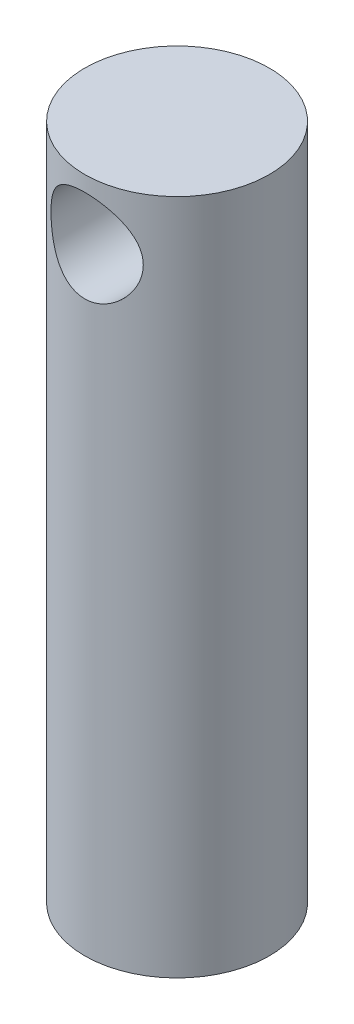
ISO-10303-21;
HEADER;
FILE_DESCRIPTION(('STEP AP214'),'2;1');
FILE_NAME('part.step','',(''),(''),'','','');
FILE_SCHEMA(('AUTOMOTIVE_DESIGN { 1 0 10303 214 1 1 1 1 }'));
ENDSEC;
DATA;
#1=APPLICATION_CONTEXT('core data for automotive mechanical design processes');
#2=APPLICATION_PROTOCOL_DEFINITION('international standard','automotive_design',2000,#1);
#3=PRODUCT_CONTEXT('',#1,'mechanical');
#4=PRODUCT('Part','Part','',(#3));
#5=PRODUCT_RELATED_PRODUCT_CATEGORY('part','',(#4));
#6=PRODUCT_DEFINITION_FORMATION('','',#4);
#7=PRODUCT_DEFINITION_CONTEXT('part definition',#1,'design');
#8=PRODUCT_DEFINITION('design','',#6,#7);
#9=PRODUCT_DEFINITION_SHAPE('','',#8);
#10=(LENGTH_UNIT() NAMED_UNIT(*) SI_UNIT(.MILLI.,.METRE.));
#11=(NAMED_UNIT(*) PLANE_ANGLE_UNIT() SI_UNIT($,.RADIAN.));
#12=(NAMED_UNIT(*) SI_UNIT($,.STERADIAN.) SOLID_ANGLE_UNIT());
#13=UNCERTAINTY_MEASURE_WITH_UNIT(LENGTH_MEASURE(1.E-05),#10,'distance_accuracy_value','');
#14=(GEOMETRIC_REPRESENTATION_CONTEXT(3) GLOBAL_UNCERTAINTY_ASSIGNED_CONTEXT((#13)) GLOBAL_UNIT_ASSIGNED_CONTEXT((#10,
#11,#12)) REPRESENTATION_CONTEXT('',''));
#15=CARTESIAN_POINT('',(0.,0.,0.));
#16=DIRECTION('',(0.,0.,1.));
#17=DIRECTION('',(1.,0.,0.));
#18=AXIS2_PLACEMENT_3D('',#15,#16,#17);
#19=CARTESIAN_POINT('',(0.,110.,0.));
#20=DIRECTION('',(0.,-1.,0.));
#21=DIRECTION('',(0.,0.,-1.));
#22=AXIS2_PLACEMENT_3D('',#19,#20,#21);
#23=CYLINDRICAL_SURFACE('',#22,15.);
#24=CARTESIAN_POINT('',(0.,107.5,-15.));
#25=CARTESIAN_POINT('',(-0.197233319634611,107.499999341654,-14.999999396748));
#26=CARTESIAN_POINT('',(-0.394480447697188,107.492210837757,-14.9961007967494));
#27=CARTESIAN_POINT('',(-0.787521887153942,107.461145658147,-14.9806046675974));
#28=CARTESIAN_POINT('',(-0.983315529042056,107.437862244582,-14.9690037891684));
#29=CARTESIAN_POINT('',(-1.37217475867236,107.376038848569,-14.9383810125726));
#30=CARTESIAN_POINT('',(-1.56523604806031,107.337477111355,-14.9193485331296));
#31=CARTESIAN_POINT('',(-1.94703954292032,107.245523957887,-14.8743407347001));
#32=CARTESIAN_POINT('',(-2.13577994705356,107.192126474356,-14.8483625753491));
#33=CARTESIAN_POINT('',(-2.50682232648196,107.071331904137,-14.7902312659494));
#34=CARTESIAN_POINT('',(-2.68914865467159,107.003996476536,-14.7581053582234));
#35=CARTESIAN_POINT('',(-3.04717071465554,106.855824594522,-14.6883654003789));
#36=CARTESIAN_POINT('',(-3.22286404618521,106.774983309117,-14.6507493870819));
#37=CARTESIAN_POINT('',(-3.73833299838093,106.513305804432,-14.5309652318162));
#38=CARTESIAN_POINT('',(-4.06690309396203,106.313182489991,-14.4417945935421));
#39=CARTESIAN_POINT('',(-4.70640207469269,105.853561695031,-14.2466964933283));
#40=CARTESIAN_POINT('',(-5.01506114711124,105.591204657963,-14.1400816438171));
#41=CARTESIAN_POINT('',(-5.44308231880779,105.163685002352,-13.9784212341451));
#42=CARTESIAN_POINT('',(-5.58001386248578,105.015395728627,-13.9242051894336));
#43=CARTESIAN_POINT('',(-5.84165491097173,104.708054400909,-13.8164776143495));
#44=CARTESIAN_POINT('',(-5.96636238182053,104.549000563222,-13.7629662024985));
#45=CARTESIAN_POINT('',(-6.21203614609388,104.208102763748,-13.6539394008806));
#46=CARTESIAN_POINT('',(-6.33195448776317,104.025448632702,-13.5985925588041));
#47=CARTESIAN_POINT('',(-6.5558172168629,103.649532833344,-13.492094780061));
#48=CARTESIAN_POINT('',(-6.65976829479199,103.456275654176,-13.4409420901999));
#49=CARTESIAN_POINT('',(-6.85079105860991,103.060225398471,-13.3445910586524));
#50=CARTESIAN_POINT('',(-6.93786789550111,102.857435255512,-13.2993909012604));
#51=CARTESIAN_POINT('',(-7.09420885808462,102.443585588166,-13.2166574842323));
#52=CARTESIAN_POINT('',(-7.16347495754887,102.232526983073,-13.1791233751457));
#53=CARTESIAN_POINT('',(-7.27969095551671,101.81656370687,-13.1152671777941));
#54=CARTESIAN_POINT('',(-7.32772731202128,101.61204530522,-13.088409003038));
#55=CARTESIAN_POINT('',(-7.40657415403486,101.198712654553,-13.0439533148363));
#56=CARTESIAN_POINT('',(-7.43738537640827,100.989898589695,-13.0263554052528));
#57=CARTESIAN_POINT('',(-7.48128583073154,100.569989048897,-13.0011924893624));
#58=CARTESIAN_POINT('',(-7.49439005257304,100.358895655336,-12.993618996979));
#59=CARTESIAN_POINT('',(-7.50270600478308,99.9362481207691,-12.9888194928446));
#60=CARTESIAN_POINT('',(-7.49791944225105,99.7246940256466,-12.9915924938538));
#61=CARTESIAN_POINT('',(-7.47218723712111,99.3284463588686,-13.0064057924061));
#62=CARTESIAN_POINT('',(-7.4532487913187,99.143574771867,-13.0172945533465));
#63=CARTESIAN_POINT('',(-7.40181622089092,98.7762705501265,-13.0466085215773));
#64=CARTESIAN_POINT('',(-7.3693176158615,98.5938387420939,-13.065036219764));
#65=CARTESIAN_POINT('',(-7.29114561844776,98.2327060817986,-13.1088213055836));
#66=CARTESIAN_POINT('',(-7.2454740017169,98.054004730169,-13.1341777592319));
#67=CARTESIAN_POINT('',(-7.14141020631305,97.701285292152,-13.1910489784068));
#68=CARTESIAN_POINT('',(-7.08301295083101,97.5272691060997,-13.222566201213));
#69=CARTESIAN_POINT('',(-6.952557362139,97.1809652803046,-13.2916331750086));
#70=CARTESIAN_POINT('',(-6.88021734471418,97.0088080124419,-13.3293043213991));
#71=CARTESIAN_POINT('',(-6.72336395223288,96.6711780704148,-13.4091058014596));
#72=CARTESIAN_POINT('',(-6.63884653289771,96.5057076405098,-13.4512376153395));
#73=CARTESIAN_POINT('',(-6.36789880537373,96.0204162252512,-13.5827161365204));
#74=CARTESIAN_POINT('',(-6.16401254035423,95.7115559327346,-13.6771793137099));
#75=CARTESIAN_POINT('',(-5.68542700201844,95.0910010807055,-13.8835116827651));
#76=CARTESIAN_POINT('',(-5.40502682962122,94.783912836628,-13.9960691755619));
#77=CARTESIAN_POINT('',(-4.9488124727457,94.3606371814819,-14.1610583156088));
#78=CARTESIAN_POINT('',(-4.79069598182255,94.2256991941219,-14.2154461134507));
#79=CARTESIAN_POINT('',(-4.46319636456159,93.9689852051238,-14.3216433742747));
#80=CARTESIAN_POINT('',(-4.29381176943409,93.8472109248178,-14.3734524995837));
#81=CARTESIAN_POINT('',(-3.93649737411746,93.6123701181065,-14.4755004113358));
#82=CARTESIAN_POINT('',(-3.74807068630637,93.4999775677542,-14.5255523150678));
#83=CARTESIAN_POINT('',(-3.36104932929111,93.2916761079377,-14.6199518429338));
#84=CARTESIAN_POINT('',(-3.16245928376597,93.1957597878569,-14.6643020292947));
#85=CARTESIAN_POINT('',(-2.7564449872104,93.0214040648737,-14.7460120172744));
#86=CARTESIAN_POINT('',(-2.54902420588263,92.9429578718744,-14.7833745338763));
#87=CARTESIAN_POINT('',(-2.12686703288175,92.8044619712916,-14.8499857401209));
#88=CARTESIAN_POINT('',(-1.91213148593979,92.7444101474207,-14.8792353631224));
#89=CARTESIAN_POINT('',(-1.49520060410314,92.6477005910272,-14.9266434935569));
#90=CARTESIAN_POINT('',(-1.29343993576982,92.6095170641766,-14.9455200325964));
#91=CARTESIAN_POINT('',(-0.886879460889928,92.549788635032,-14.9751451894528));
#92=CARTESIAN_POINT('',(-0.682079820268403,92.5282428277162,-14.9858942493696));
#93=CARTESIAN_POINT('',(-0.271216089694758,92.5020802581073,-14.9989557072523));
#94=CARTESIAN_POINT('',(-0.0651525383335521,92.4974567271315,-15.0012714784182));
#95=CARTESIAN_POINT('',(0.346571468999541,92.5051833923449,-14.9974085489777));
#96=CARTESIAN_POINT('',(0.552231942407391,92.5175328373464,-14.9912302243018));
#97=CARTESIAN_POINT('',(0.945483703972702,92.557417675707,-14.9713647745727));
#98=CARTESIAN_POINT('',(1.13323569327501,92.5836965442797,-14.9582993834851));
#99=CARTESIAN_POINT('',(1.5057028354874,92.6502612153465,-14.9254086100729));
#100=CARTESIAN_POINT('',(1.69041693509205,92.6905517730799,-14.9055809328309));
#101=CARTESIAN_POINT('',(2.05548161642885,92.7847023066896,-14.8596377637143));
#102=CARTESIAN_POINT('',(2.23583357633264,92.8385579337904,-14.8335242870997));
#103=CARTESIAN_POINT('',(2.59122720556855,92.9593477059503,-14.7755872196551));
#104=CARTESIAN_POINT('',(2.76626677748716,93.0262869409735,-14.743761406929));
#105=CARTESIAN_POINT('',(3.11487231777693,93.1747192448521,-14.6741281629767));
#106=CARTESIAN_POINT('',(3.28825774429608,93.2565692973588,-14.636177437618));
#107=CARTESIAN_POINT('',(3.62748137850216,93.4328126701688,-14.5558172256269));
#108=CARTESIAN_POINT('',(3.79331700210342,93.5272102424433,-14.5134062285665));
#109=CARTESIAN_POINT('',(4.27827609975166,93.8282076145844,-14.3808355856942));
#110=CARTESIAN_POINT('',(4.58503393852599,94.0526902505338,-14.2853004428519));
#111=CARTESIAN_POINT('',(5.18834638761034,94.5682754065004,-14.0780904901238));
#112=CARTESIAN_POINT('',(5.48094083116617,94.8637552816684,-13.9657520358616));
#113=CARTESIAN_POINT('',(5.88061884377912,95.340444988006,-13.7999731666702));
#114=CARTESIAN_POINT('',(6.00738638095381,95.5050505178604,-13.7451298302383));
#115=CARTESIAN_POINT('',(6.24720364816647,95.8448036331072,-13.6378032341987));
#116=CARTESIAN_POINT('',(6.36025132582032,96.0199527898958,-13.5853203284304));
#117=CARTESIAN_POINT('',(6.57696128828773,96.3886946069377,-13.4817918944242));
#118=CARTESIAN_POINT('',(6.67989625516331,96.5827702091917,-13.430941525462));
#119=CARTESIAN_POINT('',(6.86878239405518,96.980358898624,-13.3353302893677));
#120=CARTESIAN_POINT('',(6.95474175273572,97.1838673779432,-13.2905664901843));
#121=CARTESIAN_POINT('',(7.10870779446041,97.5989123974298,-13.2088558963579));
#122=CARTESIAN_POINT('',(7.17672888846673,97.8104423362053,-13.1719028316166));
#123=CARTESIAN_POINT('',(7.29397564807538,98.2400374115257,-13.1073420248173));
#124=CARTESIAN_POINT('',(7.3432042238577,98.4581015305522,-13.0797328358565));
#125=CARTESIAN_POINT('',(7.41830673858422,98.8776435975368,-13.0372695609292));
#126=CARTESIAN_POINT('',(7.4459689347645,99.0787043160051,-13.021445483554));
#127=CARTESIAN_POINT('',(7.48490769106324,99.4829204944751,-12.9991026119521));
#128=CARTESIAN_POINT('',(7.49618536553766,99.6860758110709,-12.9925831848914));
#129=CARTESIAN_POINT('',(7.50218225151114,100.092635176678,-12.9891213170173));
#130=CARTESIAN_POINT('',(7.49690758753643,100.296039105861,-12.9921753339361));
#131=CARTESIAN_POINT('',(7.469894240452,100.701379082305,-13.0077254939855));
#132=CARTESIAN_POINT('',(7.44815623134422,100.903315189318,-13.0202212505754));
#133=CARTESIAN_POINT('',(7.39139793729182,101.28483573048,-13.0525163509744));
#134=CARTESIAN_POINT('',(7.35784677050872,101.464710801151,-13.0715029011715));
#135=CARTESIAN_POINT('',(7.27791219467992,101.820796696309,-13.116176635625));
#136=CARTESIAN_POINT('',(7.23152452505277,101.997006283265,-13.1418660444746));
#137=CARTESIAN_POINT('',(7.12639386444851,102.344673060084,-13.1991699931078));
#138=CARTESIAN_POINT('',(7.06765252360368,102.516130881201,-13.2307837414909));
#139=CARTESIAN_POINT('',(6.93829971844234,102.85353408055,-13.2990730578631));
#140=CARTESIAN_POINT('',(6.86768365648883,103.019477293725,-13.3357505854504));
#141=CARTESIAN_POINT('',(6.71002238040005,103.355947636114,-13.4158088277434));
#142=CARTESIAN_POINT('',(6.62219479035093,103.526040456359,-13.4594736551205));
#143=CARTESIAN_POINT('',(6.43424064207576,103.858368376191,-13.5503300057645));
#144=CARTESIAN_POINT('',(6.33410990987667,104.020600782877,-13.5975227237682));
#145=CARTESIAN_POINT('',(6.12213847211231,104.336544438422,-13.6942686473789));
#146=CARTESIAN_POINT('',(6.01029468923604,104.490253431664,-13.7438224714345));
#147=CARTESIAN_POINT('',(5.77548095727847,104.788512241133,-13.8441367211459));
#148=CARTESIAN_POINT('',(5.65251024494258,104.933061427883,-13.8948972293982));
#149=CARTESIAN_POINT('',(5.3803518850056,105.229442497671,-14.0027054261897));
#150=CARTESIAN_POINT('',(5.22979541793193,105.380016220801,-14.059765681286));
#151=CARTESIAN_POINT('',(4.91618955858279,105.668014773877,-14.1724674726751));
#152=CARTESIAN_POINT('',(4.75314382541697,105.805443428738,-14.2281094181856));
#153=CARTESIAN_POINT('',(4.41516652803151,106.066459758928,-14.3365905676768));
#154=CARTESIAN_POINT('',(4.24022347499012,106.19003374141,-14.3894269722129));
#155=CARTESIAN_POINT('',(3.87959731338854,106.42220279211,-14.4908173199864));
#156=CARTESIAN_POINT('',(3.69391915105051,106.530804681902,-14.5393732098487));
#157=CARTESIAN_POINT('',(3.31135574476216,106.732909967039,-14.631264866461));
#158=CARTESIAN_POINT('',(3.11439541624589,106.826291068723,-14.6745577030524));
#159=CARTESIAN_POINT('',(2.71198022789959,106.995913779731,-14.7542266224256));
#160=CARTESIAN_POINT('',(2.50652960021849,107.072163809211,-14.7906061018549));
#161=CARTESIAN_POINT('',(2.08904591147875,107.206515609731,-14.8553158088887));
#162=CARTESIAN_POINT('',(1.87702833672874,107.264656963048,-14.8836635799129));
#163=CARTESIAN_POINT('',(1.44785490772256,107.362207070422,-14.9315196572219));
#164=CARTESIAN_POINT('',(1.23070227758585,107.401627267338,-14.9510333627761));
#165=CARTESIAN_POINT('',(0.844562643439674,107.45421167668,-14.9771457489839));
#166=CARTESIAN_POINT('',(0.6762387583752,107.471367598057,-14.9857011054743));
#167=CARTESIAN_POINT('',(0.338613325294021,107.494262199857,-14.9971285683414));
#168=CARTESIAN_POINT('',(0.169311750421737,107.500000565146,-15.0000005178519));
#169=CARTESIAN_POINT('',(0.,107.5,-15.));
#170=B_SPLINE_CURVE_WITH_KNOTS('',3,(#24,#25,#26,#27,#28,#29,#30,#31,#32,#33,#34,#35,#36,#37,
#38,#39,#40,#41,#42,#43,#44,#45,#46,#47,#48,#49,#50,#51,#52,#53,#54,#55,#56,#57,#58,#59,#60,#61,
#62,#63,#64,#65,#66,#67,#68,#69,#70,#71,#72,#73,#74,#75,#76,#77,#78,#79,#80,#81,#82,#83,#84,#85,
#86,#87,#88,#89,#90,#91,#92,#93,#94,#95,#96,#97,#98,#99,#100,#101,#102,#103,#104,#105,#106,#107,
#108,#109,#110,#111,#112,#113,#114,#115,#116,#117,#118,#119,#120,#121,#122,#123,#124,#125,#126,
#127,#128,#129,#130,#131,#132,#133,#134,#135,#136,#137,#138,#139,#140,#141,#142,#143,#144,#145,
#146,#147,#148,#149,#150,#151,#152,#153,#154,#155,#156,#157,#158,#159,#160,#161,#162,#163,#164,
#165,#166,#167,#168,#169),.UNSPECIFIED.,.T.,.F.,(4,2,2,2,2,2,2,2,2,2,2,2,2,2,2,2,2,2,2,2,2,2,2,
2,2,2,2,2,2,2,2,2,2,2,2,2,2,2,2,2,2,2,2,2,2,2,2,2,2,2,2,2,2,2,2,2,2,2,2,2,2,2,2,2,2,2,2,2,2,2,2,
2,4),(0.,0.591532941974834,1.18332327605673,1.77595930484633,2.36883805772764,2.95914801973938,
3.5496695871672,4.72943162533673,5.98056661136064,6.60703434534514,7.2336061407615,
7.90898079290036,8.58407167742324,9.25895615909366,9.93376581833204,10.568238808629,
11.2026846550832,11.8365930731243,12.4704410065579,13.028257193232,13.5862578337467,
14.1441832938005,14.7023317433305,15.273234855264,15.8443280107123,16.9859990925924,
18.2724305981167,18.9164473004745,19.5605481150863,20.2347844625213,20.9087167558919,
21.5823866537382,22.2559790161609,22.8737744253103,23.4915362266238,24.109050904515,
24.7265382534065,25.2959739410995,25.8656030708237,26.4350498171613,27.0047185399872,
27.5904412613962,28.176362974779,29.3476075788121,30.6338695709977,31.2779290064003,
31.9220846696312,32.5976781105397,33.2729449395212,33.9476676191321,34.6222857698159,
35.2321453015405,35.841963353115,36.4515557926873,37.0611232771687,37.6123930023858,
38.1638459202211,38.7152252248815,39.2668185053848,39.8552593497835,40.4439003831458,
41.0326964570339,41.621532950202,42.2821059690619,42.942486187842,43.6035134248762,
44.2642384827034,44.9300352143687,45.5955039784387,46.2595077713263,46.9231051837462,
47.4308830472037,47.9386749254899),.UNSPECIFIED.);
#171=CARTESIAN_POINT('',(0.,107.5,-15.));
#172=VERTEX_POINT('',#171);
#173=EDGE_CURVE('E38',#172,#172,#170,.T.);
#174=ORIENTED_EDGE('',*,*,#173,.T.);
#175=EDGE_LOOP('',(#174));
#176=FACE_BOUND('',#175,.T.);
#177=CARTESIAN_POINT('',(7.5,100.,12.9903810567666));
#178=CARTESIAN_POINT('',(7.49999915219101,99.8045027075097,12.990382181035));
#179=CARTESIAN_POINT('',(7.49234594296004,99.6089883720944,12.9948093228963));
#180=CARTESIAN_POINT('',(7.46183346896063,99.219466437664,13.0123535007346));
#181=CARTESIAN_POINT('',(7.43896712498941,99.0254595826722,13.0254745822937));
#182=CARTESIAN_POINT('',(7.37828654739347,98.6402324466903,13.0599426771176));
#183=CARTESIAN_POINT('',(7.34044887204588,98.4490170256547,13.0813025892036));
#184=CARTESIAN_POINT('',(7.2502832763033,98.0709635217319,13.1314907641568));
#185=CARTESIAN_POINT('',(7.19794905465278,97.8841273807909,13.1603222743731));
#186=CARTESIAN_POINT('',(7.0797153930125,97.5171446145992,13.2243001063235));
#187=CARTESIAN_POINT('',(7.01389642712031,97.3369654640602,13.2594088156932));
#188=CARTESIAN_POINT('',(6.86912607915749,96.9830973775755,13.3349831889209));
#189=CARTESIAN_POINT('',(6.79016961496391,96.8094109852621,13.3754509246287));
#190=CARTESIAN_POINT('',(6.53458165294547,96.2995135638977,13.5031657459223));
#191=CARTESIAN_POINT('',(6.33911850533735,95.9741170450987,13.5967885797889));
#192=CARTESIAN_POINT('',(5.88499039409602,95.332657055592,13.7997722488749));
#193=CARTESIAN_POINT('',(5.62244233404367,95.0195769022991,13.9097942423497));
#194=CARTESIAN_POINT('',(5.04935146826094,94.4394166569476,14.1279092446598));
#195=CARTESIAN_POINT('',(4.73878486768893,94.17235951037,14.236001267344));
#196=CARTESIAN_POINT('',(4.2304948124252,93.8031564517859,14.3922677411176));
#197=CARTESIAN_POINT('',(4.04756743682241,93.6821262489861,14.4449049107873));
#198=CARTESIAN_POINT('',(3.67082661069007,93.456054541473,14.5452036331898));
#199=CARTESIAN_POINT('',(3.47701785131802,93.3510062180578,14.5928673051336));
#200=CARTESIAN_POINT('',(3.07976082483331,93.1579355059535,14.6818428286494));
#201=CARTESIAN_POINT('',(2.87631491831239,93.0699089743988,14.723156225286));
#202=CARTESIAN_POINT('',(2.46119546749127,92.9118535156351,14.7982086294623));
#203=CARTESIAN_POINT('',(2.24952279985796,92.8418226767751,14.8319484414824));
#204=CARTESIAN_POINT('',(1.83496193120692,92.724978238187,14.8887046642508));
#205=CARTESIAN_POINT('',(1.63251998867096,92.6768674257841,14.9123131648938));
#206=CARTESIAN_POINT('',(1.22357492349569,92.5975520473387,14.9514227342515));
#207=CARTESIAN_POINT('',(1.01707197783207,92.5663467462504,14.9669241554582));
#208=CARTESIAN_POINT('',(0.601825595664957,92.5212701222078,14.9893635097996));
#209=CARTESIAN_POINT('',(0.393083355690398,92.507389965861,14.9963058068642));
#210=CARTESIAN_POINT('',(-0.0249331184730676,92.4971285345752,15.0014351981526));
#211=CARTESIAN_POINT('',(-0.234207319330807,92.5007461890299,14.9996228280321));
#212=CARTESIAN_POINT('',(-0.633235066994367,92.5243456592291,14.9878390819988));
#213=CARTESIAN_POINT('',(-0.823098331279904,92.5428718157592,14.9785935489249));
#214=CARTESIAN_POINT('',(-1.2004649364417,92.5942485270567,14.953081841927));
#215=CARTESIAN_POINT('',(-1.38796745628717,92.6271039310508,14.9368132913303));
#216=CARTESIAN_POINT('',(-1.75920233284615,92.706767666258,14.8976520521443));
#217=CARTESIAN_POINT('',(-1.94293598100011,92.7535711296905,14.8747616746105));
#218=CARTESIAN_POINT('',(-2.30560974309449,92.8606769177693,14.8228789596523));
#219=CARTESIAN_POINT('',(-2.48454796248767,92.9209844920072,14.793884249491));
#220=CARTESIAN_POINT('',(-2.83889506276332,93.0554296415602,14.7300206386001));
#221=CARTESIAN_POINT('',(-3.01422444013303,93.1297418277404,14.695078180897));
#222=CARTESIAN_POINT('',(-3.35792342376137,93.291019179494,14.6203739158272));
#223=CARTESIAN_POINT('',(-3.52629066033773,93.3779886083871,14.5806104853759));
#224=CARTESIAN_POINT('',(-4.01963951499523,93.6568860352739,14.4553576002534));
#225=CARTESIAN_POINT('',(-4.33307864865503,93.8668837080235,14.3638660854075));
#226=CARTESIAN_POINT('',(-4.95139135165847,94.3517800055694,14.1633050914297));
#227=CARTESIAN_POINT('',(-5.25265452762021,94.6309371291114,14.0533915290052));
#228=CARTESIAN_POINT('',(-5.66743502568294,95.0834783971829,13.8889325397244));
#229=CARTESIAN_POINT('',(-5.79959345558813,95.2400881113365,13.8341410663629));
#230=CARTESIAN_POINT('',(-6.05093566976301,95.5639910842674,13.7260650185139));
#231=CARTESIAN_POINT('',(-6.17011742175537,95.7312860099651,13.6727806810234));
#232=CARTESIAN_POINT('',(-6.4019009242339,96.0867503982969,13.5658760225877));
#233=CARTESIAN_POINT('',(-6.51359631862866,96.2755706607267,13.5124515808189));
#234=CARTESIAN_POINT('',(-6.72046150393887,96.6632882439877,13.4107672748936));
#235=CARTESIAN_POINT('',(-6.81563874962026,96.862180966412,13.3625050847668));
#236=CARTESIAN_POINT('',(-6.9885142895062,97.2688021742505,13.2729104159533));
#237=CARTESIAN_POINT('',(-7.06622290622511,97.4765253548362,13.2315738484945));
#238=CARTESIAN_POINT('',(-7.203263328871,97.8994328425999,13.1574724129662));
#239=CARTESIAN_POINT('',(-7.26259764057921,98.1146161279573,13.1247063761921));
#240=CARTESIAN_POINT('',(-7.35808542088785,98.533378548511,13.0713934707128));
#241=CARTESIAN_POINT('',(-7.39570258614447,98.7365270358091,13.0500843955534));
#242=CARTESIAN_POINT('',(-7.45408812476479,99.1459943117538,13.01682404884));
#243=CARTESIAN_POINT('',(-7.4748574502663,99.3523129205727,13.0048722484707));
#244=CARTESIAN_POINT('',(-7.49921791198354,99.7661730074824,12.9908402257778));
#245=CARTESIAN_POINT('',(-7.50281942614748,99.9737136708422,12.9887540396929));
#246=CARTESIAN_POINT('',(-7.49281311131347,100.388232184846,12.9945291406031));
#247=CARTESIAN_POINT('',(-7.47920644393669,100.595210072534,13.0023897561492));
#248=CARTESIAN_POINT('',(-7.43743545480093,100.984127296241,13.0263214416929));
#249=CARTESIAN_POINT('',(-7.41103301062551,101.166321224041,13.0413965730853));
#250=CARTESIAN_POINT('',(-7.34507135546585,101.527631993653,13.0786605468612));
#251=CARTESIAN_POINT('',(-7.3055077932621,101.706747797177,13.1008517418108));
#252=CARTESIAN_POINT('',(-7.21365869037155,102.060718808084,13.1516491814642));
#253=CARTESIAN_POINT('',(-7.16137480480641,102.235574566513,13.1802545915359));
#254=CARTESIAN_POINT('',(-7.04455822855378,102.580177364355,13.2430583471052));
#255=CARTESIAN_POINT('',(-6.98002075757781,102.749922379956,13.2772588746105));
#256=CARTESIAN_POINT('',(-6.83600462250947,103.091097380305,13.3520005151611));
#257=CARTESIAN_POINT('',(-6.75597608169156,103.262247016584,13.392760622743));
#258=CARTESIAN_POINT('',(-6.58369023646962,103.597293968577,13.4782889012486));
#259=CARTESIAN_POINT('',(-6.4914288250574,103.761188823846,13.523058416627));
#260=CARTESIAN_POINT('',(-6.29525608536943,104.081048676015,13.6154877679512));
#261=CARTESIAN_POINT('',(-6.19134185521639,104.237011683546,13.6631483224838));
#262=CARTESIAN_POINT('',(-5.97243402893727,104.540377235757,13.7602460013661));
#263=CARTESIAN_POINT('',(-5.85743970861164,104.687779219875,13.8096832417081));
#264=CARTESIAN_POINT('',(-5.60169452099005,104.991518201046,13.9155491573882));
#265=CARTESIAN_POINT('',(-5.45952512014944,105.146630966318,13.9720719689066));
#266=CARTESIAN_POINT('',(-5.16258673777422,105.444437897574,14.0844912504233));
#267=CARTESIAN_POINT('',(-5.00782116373766,105.587135400648,14.1403878851899));
#268=CARTESIAN_POINT('',(-4.68629256911222,105.859443081738,14.2501767276826));
#269=CARTESIAN_POINT('',(-4.51952082941854,105.98904358089,14.30406743469));
#270=CARTESIAN_POINT('',(-4.17498562481308,106.234113029696,14.4083960180679));
#271=CARTESIAN_POINT('',(-3.99722686865767,106.349587970853,14.4588353543454));
#272=CARTESIAN_POINT('',(-3.62665426587056,106.568479569685,14.5562721242769));
#273=CARTESIAN_POINT('',(-3.43356346802264,106.671486305081,14.6031397998663));
#274=CARTESIAN_POINT('',(-3.03801844269128,106.86064684491,14.6905221014912));
#275=CARTESIAN_POINT('',(-2.83556867500389,106.946808576132,14.7310397139005));
#276=CARTESIAN_POINT('',(-2.42275459239428,107.101324269796,14.8045326784762));
#277=CARTESIAN_POINT('',(-2.21239399580204,107.169686481729,14.8375115237449));
#278=CARTESIAN_POINT('',(-1.7853699767944,107.28776430405,14.8949267083421));
#279=CARTESIAN_POINT('',(-1.56870730506274,107.337482125578,14.9193640606296));
#280=CARTESIAN_POINT('',(-1.1511037549259,107.413892147217,14.9570987709583));
#281=CARTESIAN_POINT('',(-0.950545284981373,107.442279000248,14.9712127859299));
#282=CARTESIAN_POINT('',(-0.547388996951617,107.482740024468,14.9913670911193));
#283=CARTESIAN_POINT('',(-0.344791309117518,107.494815230954,14.9974078937421));
#284=CARTESIAN_POINT('',(0.0607319557057523,107.502494870721,15.0012472475445));
#285=CARTESIAN_POINT('',(0.263657416995012,107.498104211128,14.9990482543318));
#286=CARTESIAN_POINT('',(0.66822867815848,107.472920747299,14.9864747243643));
#287=CARTESIAN_POINT('',(0.869874513106675,107.4521283946,14.9761004126756));
#288=CARTESIAN_POINT('',(1.25700134962123,107.396325299527,14.9484141785526));
#289=CARTESIAN_POINT('',(1.44266872616873,107.362346994137,14.9316070193227));
#290=CARTESIAN_POINT('',(1.81031162182536,107.280675878868,14.8915068164159));
#291=CARTESIAN_POINT('',(1.99228585873568,107.23297839025,14.8682115601484));
#292=CARTESIAN_POINT('',(2.35129713393642,107.124364218719,14.8156777873291));
#293=CARTESIAN_POINT('',(2.52833560154831,107.063451408585,14.7864410121111));
#294=CARTESIAN_POINT('',(2.87660018897092,106.928927556779,14.7226536726119));
#295=CARTESIAN_POINT('',(3.04782401602415,106.855311574157,14.6881010412765));
#296=CARTESIAN_POINT('',(3.39064537651027,106.692609790261,14.6128573725765));
#297=CARTESIAN_POINT('',(3.5619512975375,106.603000648654,14.5719682662374));
#298=CARTESIAN_POINT('',(3.89641126112143,106.41133098857,14.4861257520595));
#299=CARTESIAN_POINT('',(4.05956249787546,106.309266225463,14.4411709600745));
#300=CARTESIAN_POINT('',(4.53562791530358,105.985424893662,14.3016508219336));
#301=CARTESIAN_POINT('',(4.8353211533417,105.745921280571,14.2023915191711));
#302=CARTESIAN_POINT('',(5.42194343509696,105.198939104434,13.9896182489816));
#303=CARTESIAN_POINT('',(5.70463394069457,104.887067769233,13.8756687454419));
#304=CARTESIAN_POINT('',(6.08732189150511,104.38620676034,13.7099949874917));
#305=CARTESIAN_POINT('',(6.20807712903995,104.213585387723,13.6556020697553));
#306=CARTESIAN_POINT('',(6.43508648513725,103.857995239158,13.5501034682427));
#307=CARTESIAN_POINT('',(6.54133858592571,103.675025028409,13.4989982423941));
#308=CARTESIAN_POINT('',(6.74160896775216,103.293715946619,13.4001340435359));
#309=CARTESIAN_POINT('',(6.83512717738289,103.095072680908,13.352534408331));
#310=CARTESIAN_POINT('',(7.00478946882537,102.689104637802,13.2643156538703));
#311=CARTESIAN_POINT('',(7.08094249897426,102.481784397169,13.2236929420577));
#312=CARTESIAN_POINT('',(7.21481348107953,102.060391434838,13.1511314354761));
#313=CARTESIAN_POINT('',(7.27257885859355,101.846337675048,13.1191703328352));
#314=CARTESIAN_POINT('',(7.36906123355885,101.412860919224,13.0652214956916));
#315=CARTESIAN_POINT('',(7.40779154896141,101.193441790244,13.0432267890063));
#316=CARTESIAN_POINT('',(7.45773453230136,100.811503324841,13.0147131582628));
#317=CARTESIAN_POINT('',(7.47356894324815,100.649763754555,13.0056107894155));
#318=CARTESIAN_POINT('',(7.49470238224566,100.325353431126,12.9934440689235));
#319=CARTESIAN_POINT('',(7.50000070550228,100.162682616418,12.9903801212092));
#320=CARTESIAN_POINT('',(7.5,100.,12.9903810567666));
#321=B_SPLINE_CURVE_WITH_KNOTS('',3,(#177,#178,#179,#180,#181,#182,#183,#184,#185,#186,#187,
#188,#189,#190,#191,#192,#193,#194,#195,#196,#197,#198,#199,#200,#201,#202,#203,#204,#205,#206,
#207,#208,#209,#210,#211,#212,#213,#214,#215,#216,#217,#218,#219,#220,#221,#222,#223,#224,#225,
#226,#227,#228,#229,#230,#231,#232,#233,#234,#235,#236,#237,#238,#239,#240,#241,#242,#243,#244,
#245,#246,#247,#248,#249,#250,#251,#252,#253,#254,#255,#256,#257,#258,#259,#260,#261,#262,#263,
#264,#265,#266,#267,#268,#269,#270,#271,#272,#273,#274,#275,#276,#277,#278,#279,#280,#281,#282,
#283,#284,#285,#286,#287,#288,#289,#290,#291,#292,#293,#294,#295,#296,#297,#298,#299,#300,#301,
#302,#303,#304,#305,#306,#307,#308,#309,#310,#311,#312,#313,#314,#315,#316,#317,#318,#319,#320),
.UNSPECIFIED.,.T.,.F.,(4,2,2,2,2,2,2,2,2,2,2,2,2,2,2,2,2,2,2,2,2,2,2,2,2,2,2,2,2,2,2,2,2,2,2,2,
2,2,2,2,2,2,2,2,2,2,2,2,2,2,2,2,2,2,2,2,2,2,2,2,2,2,2,2,2,2,2,2,2,2,2,4),(0.,0.586323576834724,
1.17292018151066,1.76043892185671,2.34821344249716,2.93257740658584,3.51716795442696,
4.68524892593732,5.94967082883547,7.21472131642655,7.89069130478284,8.56637207543371,
9.24188818729899,9.91733251057598,10.5447278994446,11.1720960071843,11.7991441143986,
12.4261538560646,12.9984442136809,13.5709283931728,14.1432130129766,14.7157204902737,
15.2959050840961,15.876285554844,17.0363679012784,18.3061098092582,18.9419219109116,
19.5778334442978,20.2543578506447,20.930576137907,21.6063937795331,22.2821192164369,
22.904329323652,23.5265042648717,24.1483030533765,24.7700598702128,25.3235688877657,
25.8772610840451,26.4308812744283,26.9847178849066,27.5639783078045,28.143433703745,
28.7230337220619,29.3026716490211,29.9555467841243,30.6082458877317,31.2614238706273,
31.9143238334088,32.5848580689821,33.2550760062919,33.924982764499,34.5948100496521,
35.2031527379992,35.8114568131385,36.4195796171099,37.0276856800811,37.595533030973,
38.163574268506,38.73144926462,39.2995456379106,39.8917147636492,40.4840862553716,
41.6682672089651,42.9702980901663,43.62240841601,44.2746093755581,44.9476734677058,
45.6203899398508,46.2913570079877,46.9618539608751,47.4497291246447,47.9376369229166),.UNSPECIFIED.);
#322=CARTESIAN_POINT('',(7.5,100.,12.9903810567666));
#323=VERTEX_POINT('',#322);
#324=EDGE_CURVE('E52',#323,#323,#321,.T.);
#325=ORIENTED_EDGE('',*,*,#324,.T.);
#326=EDGE_LOOP('',(#325));
#327=FACE_BOUND('',#326,.T.);
#328=CARTESIAN_POINT('',(0.,110.,0.));
#329=DIRECTION('',(0.,1.,0.));
#330=DIRECTION('',(0.,0.,1.));
#331=AXIS2_PLACEMENT_3D('',#328,#329,#330);
#332=CIRCLE('',#331,15.);
#333=CARTESIAN_POINT('',(0.,110.,15.));
#334=VERTEX_POINT('',#333);
#335=EDGE_CURVE('E10',#334,#334,#332,.T.);
#336=ORIENTED_EDGE('',*,*,#335,.F.);
#337=EDGE_LOOP('',(#336));
#338=FACE_BOUND('',#337,.T.);
#339=CARTESIAN_POINT('',(0.,0.,0.));
#340=DIRECTION('',(0.,1.,0.));
#341=DIRECTION('',(0.,0.,1.));
#342=AXIS2_PLACEMENT_3D('',#339,#340,#341);
#343=CIRCLE('',#342,15.);
#344=CARTESIAN_POINT('',(0.,0.,15.));
#345=VERTEX_POINT('',#344);
#346=EDGE_CURVE('E46',#345,#345,#343,.T.);
#347=ORIENTED_EDGE('',*,*,#346,.T.);
#348=EDGE_LOOP('',(#347));
#349=FACE_BOUND('',#348,.T.);
#350=ADVANCED_FACE('F34',(#176,#327,#338,#349),#23,.T.);
#351=CARTESIAN_POINT('',(0.,110.,0.));
#352=DIRECTION('',(0.,1.,0.));
#353=DIRECTION('',(0.,0.,1.));
#354=AXIS2_PLACEMENT_3D('',#351,#352,#353);
#355=PLANE('',#354);
#356=ORIENTED_EDGE('',*,*,#335,.T.);
#357=EDGE_LOOP('',(#356));
#358=FACE_BOUND('',#357,.T.);
#359=ADVANCED_FACE('F63',(#358),#355,.T.);
#360=CARTESIAN_POINT('',(0.,0.,0.));
#361=DIRECTION('',(0.,1.,0.));
#362=DIRECTION('',(0.,0.,1.));
#363=AXIS2_PLACEMENT_3D('',#360,#361,#362);
#364=PLANE('',#363);
#365=ORIENTED_EDGE('',*,*,#346,.F.);
#366=EDGE_LOOP('',(#365));
#367=FACE_BOUND('',#366,.T.);
#368=ADVANCED_FACE('F61',(#367),#364,.F.);
#369=CARTESIAN_POINT('',(0.,100.,-20.));
#370=DIRECTION('',(0.,0.,1.));
#371=DIRECTION('',(1.,0.,0.));
#372=AXIS2_PLACEMENT_3D('',#369,#370,#371);
#373=CYLINDRICAL_SURFACE('',#372,7.5);
#374=ORIENTED_EDGE('',*,*,#324,.F.);
#375=EDGE_LOOP('',(#374));
#376=FACE_BOUND('',#375,.T.);
#377=ORIENTED_EDGE('',*,*,#173,.F.);
#378=EDGE_LOOP('',(#377));
#379=FACE_BOUND('',#378,.T.);
#380=ADVANCED_FACE('F57',(#376,#379),#373,.F.);
#381=CLOSED_SHELL('',(#350,#359,#368,#380));
#382=MANIFOLD_SOLID_BREP('B2',#381);
#383=ADVANCED_BREP_SHAPE_REPRESENTATION('',(#18,#382),#14);
#384=SHAPE_DEFINITION_REPRESENTATION(#9,#383);
ENDSEC;
END-ISO-10303-21;
